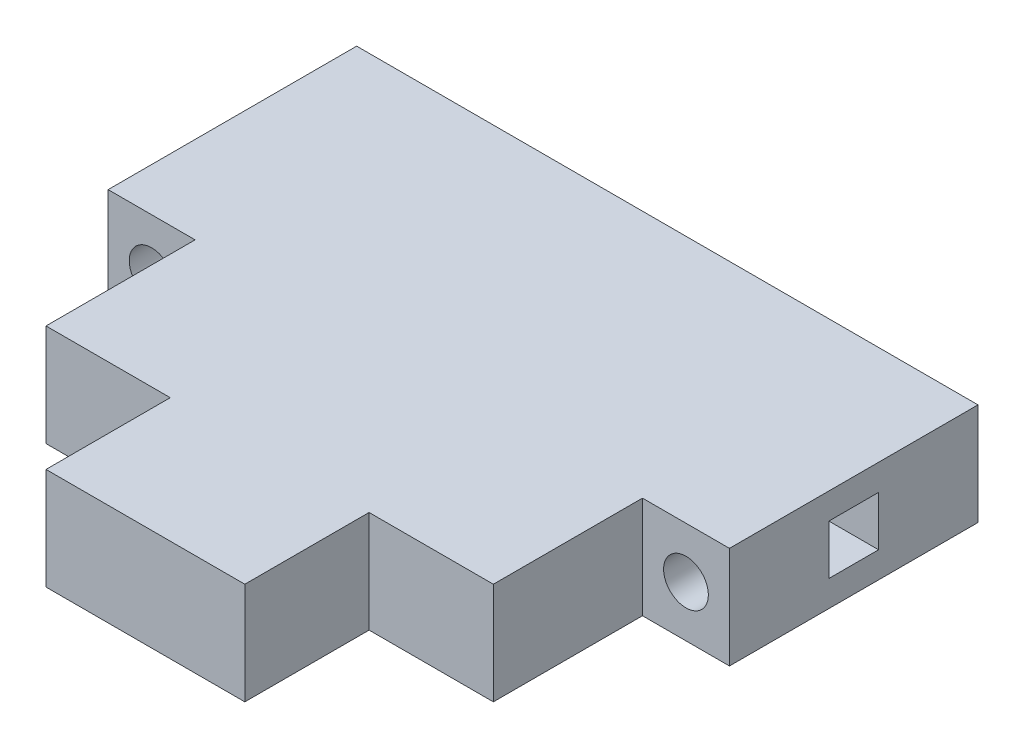
ISO-10303-21;
HEADER;
FILE_DESCRIPTION(('STEP AP214'),'2;1');
FILE_NAME('part.step','',(''),(''),'','','');
FILE_SCHEMA(('AUTOMOTIVE_DESIGN { 1 0 10303 214 1 1 1 1 }'));
ENDSEC;
DATA;
#1=APPLICATION_CONTEXT('core data for automotive mechanical design processes');
#2=APPLICATION_PROTOCOL_DEFINITION('international standard','automotive_design',2000,#1);
#3=PRODUCT_CONTEXT('',#1,'mechanical');
#4=PRODUCT('Part','Part','',(#3));
#5=PRODUCT_RELATED_PRODUCT_CATEGORY('part','',(#4));
#6=PRODUCT_DEFINITION_FORMATION('','',#4);
#7=PRODUCT_DEFINITION_CONTEXT('part definition',#1,'design');
#8=PRODUCT_DEFINITION('design','',#6,#7);
#9=PRODUCT_DEFINITION_SHAPE('','',#8);
#10=(LENGTH_UNIT() NAMED_UNIT(*) SI_UNIT(.MILLI.,.METRE.));
#11=(NAMED_UNIT(*) PLANE_ANGLE_UNIT() SI_UNIT($,.RADIAN.));
#12=(NAMED_UNIT(*) SI_UNIT($,.STERADIAN.) SOLID_ANGLE_UNIT());
#13=UNCERTAINTY_MEASURE_WITH_UNIT(LENGTH_MEASURE(1.E-05),#10,'distance_accuracy_value','');
#14=(GEOMETRIC_REPRESENTATION_CONTEXT(3) GLOBAL_UNCERTAINTY_ASSIGNED_CONTEXT((#13)) GLOBAL_UNIT_ASSIGNED_CONTEXT((#10,
#11,#12)) REPRESENTATION_CONTEXT('',''));
#15=CARTESIAN_POINT('',(0.,0.,0.));
#16=DIRECTION('',(0.,0.,1.));
#17=DIRECTION('',(1.,0.,0.));
#18=AXIS2_PLACEMENT_3D('',#15,#16,#17);
#19=CARTESIAN_POINT('',(-25.,8.2,20.));
#20=DIRECTION('',(1.,0.,0.));
#21=DIRECTION('',(0.,0.,-1.));
#22=AXIS2_PLACEMENT_3D('',#19,#20,#21);
#23=PLANE('',#22);
#24=DIRECTION('',(0.,0.,1.));
#25=VECTOR('',#24,1.);
#26=CARTESIAN_POINT('',(-25.,0.,20.));
#27=LINE('',#26,#25);
#28=CARTESIAN_POINT('',(-25.,0.,0.));
#29=VERTEX_POINT('',#28);
#30=CARTESIAN_POINT('',(-25.,0.,20.));
#31=VERTEX_POINT('',#30);
#32=EDGE_CURVE('E235',#29,#31,#27,.T.);
#33=ORIENTED_EDGE('',*,*,#32,.T.);
#34=DIRECTION('',(0.,-1.,0.));
#35=VECTOR('',#34,1.);
#36=CARTESIAN_POINT('',(-25.,8.2,20.));
#37=LINE('',#36,#35);
#38=CARTESIAN_POINT('',(-25.,8.2,20.));
#39=VERTEX_POINT('',#38);
#40=EDGE_CURVE('E11',#39,#31,#37,.T.);
#41=ORIENTED_EDGE('',*,*,#40,.F.);
#42=DIRECTION('',(0.,0.,1.));
#43=VECTOR('',#42,1.);
#44=CARTESIAN_POINT('',(-25.,8.2,20.));
#45=LINE('',#44,#43);
#46=CARTESIAN_POINT('',(-25.,8.2,0.));
#47=VERTEX_POINT('',#46);
#48=EDGE_CURVE('E244',#47,#39,#45,.T.);
#49=ORIENTED_EDGE('',*,*,#48,.F.);
#50=DIRECTION('',(0.,-1.,0.));
#51=VECTOR('',#50,1.);
#52=CARTESIAN_POINT('',(-25.,8.2,0.));
#53=LINE('',#52,#51);
#54=EDGE_CURVE('E270',#47,#29,#53,.T.);
#55=ORIENTED_EDGE('',*,*,#54,.T.);
#56=EDGE_LOOP('',(#33,#41,#49,#55));
#57=FACE_BOUND('',#56,.T.);
#58=DIRECTION('',(0.,1.,0.));
#59=VECTOR('',#58,1.);
#60=CARTESIAN_POINT('',(-25.,2.1,8.));
#61=LINE('',#60,#59);
#62=CARTESIAN_POINT('',(-25.,2.1,8.));
#63=VERTEX_POINT('',#62);
#64=CARTESIAN_POINT('',(-25.,6.1,8.));
#65=VERTEX_POINT('',#64);
#66=EDGE_CURVE('E53',#63,#65,#61,.T.);
#67=ORIENTED_EDGE('',*,*,#66,.T.);
#68=DIRECTION('',(0.,0.,1.));
#69=VECTOR('',#68,1.);
#70=CARTESIAN_POINT('',(-25.,6.1,8.));
#71=LINE('',#70,#69);
#72=CARTESIAN_POINT('',(-25.,6.1,12.));
#73=VERTEX_POINT('',#72);
#74=EDGE_CURVE('E194',#65,#73,#71,.T.);
#75=ORIENTED_EDGE('',*,*,#74,.T.);
#76=DIRECTION('',(0.,-1.,0.));
#77=VECTOR('',#76,1.);
#78=CARTESIAN_POINT('',(-25.,2.1,12.));
#79=LINE('',#78,#77);
#80=CARTESIAN_POINT('',(-25.,2.1,12.));
#81=VERTEX_POINT('',#80);
#82=EDGE_CURVE('E627',#73,#81,#79,.T.);
#83=ORIENTED_EDGE('',*,*,#82,.T.);
#84=DIRECTION('',(0.,0.,-1.));
#85=VECTOR('',#84,1.);
#86=CARTESIAN_POINT('',(-25.,2.1,8.));
#87=LINE('',#86,#85);
#88=EDGE_CURVE('E190',#81,#63,#87,.T.);
#89=ORIENTED_EDGE('',*,*,#88,.T.);
#90=EDGE_LOOP('',(#67,#75,#83,#89));
#91=FACE_BOUND('',#90,.T.);
#92=ADVANCED_FACE('F39',(#57,#91),#23,.F.);
#93=CARTESIAN_POINT('',(-18.,8.2,20.));
#94=DIRECTION('',(0.,0.,-1.));
#95=DIRECTION('',(-1.,0.,0.));
#96=AXIS2_PLACEMENT_3D('',#93,#94,#95);
#97=PLANE('',#96);
#98=CARTESIAN_POINT('',(-21.5,4.1,20.));
#99=DIRECTION('',(0.,0.,1.));
#100=DIRECTION('',(1.,0.,0.));
#101=AXIS2_PLACEMENT_3D('',#98,#99,#100);
#102=CIRCLE('',#101,1.8);
#103=CARTESIAN_POINT('',(-19.7,4.1,20.));
#104=VERTEX_POINT('',#103);
#105=EDGE_CURVE('E236',#104,#104,#102,.T.);
#106=ORIENTED_EDGE('',*,*,#105,.F.);
#107=EDGE_LOOP('',(#106));
#108=FACE_BOUND('',#107,.T.);
#109=DIRECTION('',(1.,0.,0.));
#110=VECTOR('',#109,1.);
#111=CARTESIAN_POINT('',(-18.,0.,20.));
#112=LINE('',#111,#110);
#113=CARTESIAN_POINT('',(-18.,0.,20.));
#114=VERTEX_POINT('',#113);
#115=EDGE_CURVE('E273',#31,#114,#112,.T.);
#116=ORIENTED_EDGE('',*,*,#115,.T.);
#117=DIRECTION('',(0.,-1.,0.));
#118=VECTOR('',#117,1.);
#119=CARTESIAN_POINT('',(-18.,8.2,20.));
#120=LINE('',#119,#118);
#121=CARTESIAN_POINT('',(-18.,8.2,20.));
#122=VERTEX_POINT('',#121);
#123=EDGE_CURVE('E46',#122,#114,#120,.T.);
#124=ORIENTED_EDGE('',*,*,#123,.F.);
#125=DIRECTION('',(1.,0.,0.));
#126=VECTOR('',#125,1.);
#127=CARTESIAN_POINT('',(-18.,8.2,20.));
#128=LINE('',#127,#126);
#129=EDGE_CURVE('E247',#39,#122,#128,.T.);
#130=ORIENTED_EDGE('',*,*,#129,.F.);
#131=ORIENTED_EDGE('',*,*,#40,.T.);
#132=EDGE_LOOP('',(#116,#124,#130,#131));
#133=FACE_BOUND('',#132,.T.);
#134=ADVANCED_FACE('F350',(#108,#133),#97,.F.);
#135=CARTESIAN_POINT('',(-18.,8.2,32.));
#136=DIRECTION('',(1.,0.,0.));
#137=DIRECTION('',(0.,0.,-1.));
#138=AXIS2_PLACEMENT_3D('',#135,#136,#137);
#139=PLANE('',#138);
#140=DIRECTION('',(0.,0.,1.));
#141=VECTOR('',#140,1.);
#142=CARTESIAN_POINT('',(-18.,0.,32.));
#143=LINE('',#142,#141);
#144=CARTESIAN_POINT('',(-18.,0.,32.));
#145=VERTEX_POINT('',#144);
#146=EDGE_CURVE('E275',#114,#145,#143,.T.);
#147=ORIENTED_EDGE('',*,*,#146,.T.);
#148=DIRECTION('',(0.,-1.,0.));
#149=VECTOR('',#148,1.);
#150=CARTESIAN_POINT('',(-18.,8.2,32.));
#151=LINE('',#150,#149);
#152=CARTESIAN_POINT('',(-18.,8.2,32.));
#153=VERTEX_POINT('',#152);
#154=EDGE_CURVE('E320',#153,#145,#151,.T.);
#155=ORIENTED_EDGE('',*,*,#154,.F.);
#156=DIRECTION('',(0.,0.,1.));
#157=VECTOR('',#156,1.);
#158=CARTESIAN_POINT('',(-18.,8.2,32.));
#159=LINE('',#158,#157);
#160=EDGE_CURVE('E250',#122,#153,#159,.T.);
#161=ORIENTED_EDGE('',*,*,#160,.F.);
#162=ORIENTED_EDGE('',*,*,#123,.T.);
#163=EDGE_LOOP('',(#147,#155,#161,#162));
#164=FACE_BOUND('',#163,.T.);
#165=ADVANCED_FACE('F327',(#164),#139,.F.);
#166=CARTESIAN_POINT('',(-8.,8.2,32.));
#167=DIRECTION('',(0.,0.,-1.));
#168=DIRECTION('',(-1.,0.,0.));
#169=AXIS2_PLACEMENT_3D('',#166,#167,#168);
#170=PLANE('',#169);
#171=DIRECTION('',(1.,0.,0.));
#172=VECTOR('',#171,1.);
#173=CARTESIAN_POINT('',(-8.,0.,32.));
#174=LINE('',#173,#172);
#175=CARTESIAN_POINT('',(-8.,0.,32.));
#176=VERTEX_POINT('',#175);
#177=EDGE_CURVE('E277',#145,#176,#174,.T.);
#178=ORIENTED_EDGE('',*,*,#177,.T.);
#179=DIRECTION('',(0.,-1.,0.));
#180=VECTOR('',#179,1.);
#181=CARTESIAN_POINT('',(-8.,8.2,32.));
#182=LINE('',#181,#180);
#183=CARTESIAN_POINT('',(-8.,8.2,32.));
#184=VERTEX_POINT('',#183);
#185=EDGE_CURVE('E317',#184,#176,#182,.T.);
#186=ORIENTED_EDGE('',*,*,#185,.F.);
#187=DIRECTION('',(1.,0.,0.));
#188=VECTOR('',#187,1.);
#189=CARTESIAN_POINT('',(-8.,8.2,32.));
#190=LINE('',#189,#188);
#191=EDGE_CURVE('E252',#153,#184,#190,.T.);
#192=ORIENTED_EDGE('',*,*,#191,.F.);
#193=ORIENTED_EDGE('',*,*,#154,.T.);
#194=EDGE_LOOP('',(#178,#186,#192,#193));
#195=FACE_BOUND('',#194,.T.);
#196=ADVANCED_FACE('F338',(#195),#170,.F.);
#197=CARTESIAN_POINT('',(-8.,8.2,42.));
#198=DIRECTION('',(1.,0.,0.));
#199=DIRECTION('',(0.,0.,-1.));
#200=AXIS2_PLACEMENT_3D('',#197,#198,#199);
#201=PLANE('',#200);
#202=DIRECTION('',(0.,0.,1.));
#203=VECTOR('',#202,1.);
#204=CARTESIAN_POINT('',(-8.,0.,42.));
#205=LINE('',#204,#203);
#206=CARTESIAN_POINT('',(-8.,0.,42.));
#207=VERTEX_POINT('',#206);
#208=EDGE_CURVE('E279',#176,#207,#205,.T.);
#209=ORIENTED_EDGE('',*,*,#208,.T.);
#210=DIRECTION('',(0.,-1.,0.));
#211=VECTOR('',#210,1.);
#212=CARTESIAN_POINT('',(-8.,8.2,42.));
#213=LINE('',#212,#211);
#214=CARTESIAN_POINT('',(-8.,8.2,42.));
#215=VERTEX_POINT('',#214);
#216=EDGE_CURVE('E314',#215,#207,#213,.T.);
#217=ORIENTED_EDGE('',*,*,#216,.F.);
#218=DIRECTION('',(0.,0.,1.));
#219=VECTOR('',#218,1.);
#220=CARTESIAN_POINT('',(-8.,8.2,42.));
#221=LINE('',#220,#219);
#222=EDGE_CURVE('E254',#184,#215,#221,.T.);
#223=ORIENTED_EDGE('',*,*,#222,.F.);
#224=ORIENTED_EDGE('',*,*,#185,.T.);
#225=EDGE_LOOP('',(#209,#217,#223,#224));
#226=FACE_BOUND('',#225,.T.);
#227=ADVANCED_FACE('F342',(#226),#201,.F.);
#228=CARTESIAN_POINT('',(8.,8.2,42.));
#229=DIRECTION('',(0.,0.,-1.));
#230=DIRECTION('',(-1.,0.,0.));
#231=AXIS2_PLACEMENT_3D('',#228,#229,#230);
#232=PLANE('',#231);
#233=DIRECTION('',(1.,0.,0.));
#234=VECTOR('',#233,1.);
#235=CARTESIAN_POINT('',(8.,0.,42.));
#236=LINE('',#235,#234);
#237=CARTESIAN_POINT('',(8.,0.,42.));
#238=VERTEX_POINT('',#237);
#239=EDGE_CURVE('E281',#207,#238,#236,.T.);
#240=ORIENTED_EDGE('',*,*,#239,.T.);
#241=DIRECTION('',(0.,-1.,0.));
#242=VECTOR('',#241,1.);
#243=CARTESIAN_POINT('',(8.,8.2,42.));
#244=LINE('',#243,#242);
#245=CARTESIAN_POINT('',(8.,8.2,42.));
#246=VERTEX_POINT('',#245);
#247=EDGE_CURVE('E311',#246,#238,#244,.T.);
#248=ORIENTED_EDGE('',*,*,#247,.F.);
#249=DIRECTION('',(1.,0.,0.));
#250=VECTOR('',#249,1.);
#251=CARTESIAN_POINT('',(8.,8.2,42.));
#252=LINE('',#251,#250);
#253=EDGE_CURVE('E256',#215,#246,#252,.T.);
#254=ORIENTED_EDGE('',*,*,#253,.F.);
#255=ORIENTED_EDGE('',*,*,#216,.T.);
#256=EDGE_LOOP('',(#240,#248,#254,#255));
#257=FACE_BOUND('',#256,.T.);
#258=ADVANCED_FACE('F384',(#257),#232,.F.);
#259=CARTESIAN_POINT('',(8.,8.2,32.));
#260=DIRECTION('',(-1.,0.,0.));
#261=DIRECTION('',(0.,0.,1.));
#262=AXIS2_PLACEMENT_3D('',#259,#260,#261);
#263=PLANE('',#262);
#264=DIRECTION('',(0.,0.,-1.));
#265=VECTOR('',#264,1.);
#266=CARTESIAN_POINT('',(8.,0.,32.));
#267=LINE('',#266,#265);
#268=CARTESIAN_POINT('',(8.,0.,32.));
#269=VERTEX_POINT('',#268);
#270=EDGE_CURVE('E283',#238,#269,#267,.T.);
#271=ORIENTED_EDGE('',*,*,#270,.T.);
#272=DIRECTION('',(0.,-1.,0.));
#273=VECTOR('',#272,1.);
#274=CARTESIAN_POINT('',(8.,8.2,32.));
#275=LINE('',#274,#273);
#276=CARTESIAN_POINT('',(8.,8.2,32.));
#277=VERTEX_POINT('',#276);
#278=EDGE_CURVE('E308',#277,#269,#275,.T.);
#279=ORIENTED_EDGE('',*,*,#278,.F.);
#280=DIRECTION('',(0.,0.,-1.));
#281=VECTOR('',#280,1.);
#282=CARTESIAN_POINT('',(8.,8.2,32.));
#283=LINE('',#282,#281);
#284=EDGE_CURVE('E258',#246,#277,#283,.T.);
#285=ORIENTED_EDGE('',*,*,#284,.F.);
#286=ORIENTED_EDGE('',*,*,#247,.T.);
#287=EDGE_LOOP('',(#271,#279,#285,#286));
#288=FACE_BOUND('',#287,.T.);
#289=ADVANCED_FACE('F382',(#288),#263,.F.);
#290=CARTESIAN_POINT('',(18.,8.2,32.));
#291=DIRECTION('',(0.,0.,-1.));
#292=DIRECTION('',(-1.,0.,0.));
#293=AXIS2_PLACEMENT_3D('',#290,#291,#292);
#294=PLANE('',#293);
#295=DIRECTION('',(1.,0.,0.));
#296=VECTOR('',#295,1.);
#297=CARTESIAN_POINT('',(18.,0.,32.));
#298=LINE('',#297,#296);
#299=CARTESIAN_POINT('',(18.,0.,32.));
#300=VERTEX_POINT('',#299);
#301=EDGE_CURVE('E285',#269,#300,#298,.T.);
#302=ORIENTED_EDGE('',*,*,#301,.T.);
#303=DIRECTION('',(0.,-1.,0.));
#304=VECTOR('',#303,1.);
#305=CARTESIAN_POINT('',(18.,8.2,32.));
#306=LINE('',#305,#304);
#307=CARTESIAN_POINT('',(18.,8.2,32.));
#308=VERTEX_POINT('',#307);
#309=EDGE_CURVE('E305',#308,#300,#306,.T.);
#310=ORIENTED_EDGE('',*,*,#309,.F.);
#311=DIRECTION('',(1.,0.,0.));
#312=VECTOR('',#311,1.);
#313=CARTESIAN_POINT('',(18.,8.2,32.));
#314=LINE('',#313,#312);
#315=EDGE_CURVE('E260',#277,#308,#314,.T.);
#316=ORIENTED_EDGE('',*,*,#315,.F.);
#317=ORIENTED_EDGE('',*,*,#278,.T.);
#318=EDGE_LOOP('',(#302,#310,#316,#317));
#319=FACE_BOUND('',#318,.T.);
#320=ADVANCED_FACE('F378',(#319),#294,.F.);
#321=CARTESIAN_POINT('',(18.,8.2,20.));
#322=DIRECTION('',(-1.,0.,0.));
#323=DIRECTION('',(0.,0.,1.));
#324=AXIS2_PLACEMENT_3D('',#321,#322,#323);
#325=PLANE('',#324);
#326=DIRECTION('',(0.,0.,-1.));
#327=VECTOR('',#326,1.);
#328=CARTESIAN_POINT('',(18.,0.,20.));
#329=LINE('',#328,#327);
#330=CARTESIAN_POINT('',(18.,0.,20.));
#331=VERTEX_POINT('',#330);
#332=EDGE_CURVE('E287',#300,#331,#329,.T.);
#333=ORIENTED_EDGE('',*,*,#332,.T.);
#334=DIRECTION('',(0.,-1.,0.));
#335=VECTOR('',#334,1.);
#336=CARTESIAN_POINT('',(18.,8.2,20.));
#337=LINE('',#336,#335);
#338=CARTESIAN_POINT('',(18.,8.2,20.));
#339=VERTEX_POINT('',#338);
#340=EDGE_CURVE('E302',#339,#331,#337,.T.);
#341=ORIENTED_EDGE('',*,*,#340,.F.);
#342=DIRECTION('',(0.,0.,-1.));
#343=VECTOR('',#342,1.);
#344=CARTESIAN_POINT('',(18.,8.2,20.));
#345=LINE('',#344,#343);
#346=EDGE_CURVE('E262',#308,#339,#345,.T.);
#347=ORIENTED_EDGE('',*,*,#346,.F.);
#348=ORIENTED_EDGE('',*,*,#309,.T.);
#349=EDGE_LOOP('',(#333,#341,#347,#348));
#350=FACE_BOUND('',#349,.T.);
#351=ADVANCED_FACE('F373',(#350),#325,.F.);
#352=CARTESIAN_POINT('',(25.,8.2,20.));
#353=DIRECTION('',(0.,0.,-1.));
#354=DIRECTION('',(-1.,0.,0.));
#355=AXIS2_PLACEMENT_3D('',#352,#353,#354);
#356=PLANE('',#355);
#357=CARTESIAN_POINT('',(21.5,4.1,20.));
#358=DIRECTION('',(0.,0.,1.));
#359=DIRECTION('',(1.,0.,0.));
#360=AXIS2_PLACEMENT_3D('',#357,#358,#359);
#361=CIRCLE('',#360,1.8);
#362=CARTESIAN_POINT('',(23.3,4.1,20.));
#363=VERTEX_POINT('',#362);
#364=EDGE_CURVE('E239',#363,#363,#361,.T.);
#365=ORIENTED_EDGE('',*,*,#364,.F.);
#366=EDGE_LOOP('',(#365));
#367=FACE_BOUND('',#366,.T.);
#368=DIRECTION('',(1.,0.,0.));
#369=VECTOR('',#368,1.);
#370=CARTESIAN_POINT('',(25.,0.,20.));
#371=LINE('',#370,#369);
#372=CARTESIAN_POINT('',(25.,0.,20.));
#373=VERTEX_POINT('',#372);
#374=EDGE_CURVE('E289',#331,#373,#371,.T.);
#375=ORIENTED_EDGE('',*,*,#374,.T.);
#376=DIRECTION('',(0.,-1.,0.));
#377=VECTOR('',#376,1.);
#378=CARTESIAN_POINT('',(25.,8.2,20.));
#379=LINE('',#378,#377);
#380=CARTESIAN_POINT('',(25.,8.2,20.));
#381=VERTEX_POINT('',#380);
#382=EDGE_CURVE('E299',#381,#373,#379,.T.);
#383=ORIENTED_EDGE('',*,*,#382,.F.);
#384=DIRECTION('',(1.,0.,0.));
#385=VECTOR('',#384,1.);
#386=CARTESIAN_POINT('',(25.,8.2,20.));
#387=LINE('',#386,#385);
#388=EDGE_CURVE('E264',#339,#381,#387,.T.);
#389=ORIENTED_EDGE('',*,*,#388,.F.);
#390=ORIENTED_EDGE('',*,*,#340,.T.);
#391=EDGE_LOOP('',(#375,#383,#389,#390));
#392=FACE_BOUND('',#391,.T.);
#393=ADVANCED_FACE('F367',(#367,#392),#356,.F.);
#394=CARTESIAN_POINT('',(25.,8.2,0.));
#395=DIRECTION('',(-1.,0.,0.));
#396=DIRECTION('',(0.,0.,1.));
#397=AXIS2_PLACEMENT_3D('',#394,#395,#396);
#398=PLANE('',#397);
#399=DIRECTION('',(0.,0.,1.));
#400=VECTOR('',#399,1.);
#401=CARTESIAN_POINT('',(25.,6.1,8.));
#402=LINE('',#401,#400);
#403=CARTESIAN_POINT('',(25.,6.1,8.));
#404=VERTEX_POINT('',#403);
#405=CARTESIAN_POINT('',(25.,6.1,12.));
#406=VERTEX_POINT('',#405);
#407=EDGE_CURVE('E197',#404,#406,#402,.T.);
#408=ORIENTED_EDGE('',*,*,#407,.F.);
#409=DIRECTION('',(0.,1.,0.));
#410=VECTOR('',#409,1.);
#411=CARTESIAN_POINT('',(25.,2.1,8.));
#412=LINE('',#411,#410);
#413=CARTESIAN_POINT('',(25.,2.1,8.));
#414=VERTEX_POINT('',#413);
#415=EDGE_CURVE('E61',#414,#404,#412,.T.);
#416=ORIENTED_EDGE('',*,*,#415,.F.);
#417=DIRECTION('',(0.,0.,-1.));
#418=VECTOR('',#417,1.);
#419=CARTESIAN_POINT('',(25.,2.1,8.));
#420=LINE('',#419,#418);
#421=CARTESIAN_POINT('',(25.,2.1,12.));
#422=VERTEX_POINT('',#421);
#423=EDGE_CURVE('E207',#422,#414,#420,.T.);
#424=ORIENTED_EDGE('',*,*,#423,.F.);
#425=DIRECTION('',(0.,-1.,0.));
#426=VECTOR('',#425,1.);
#427=CARTESIAN_POINT('',(25.,2.1,12.));
#428=LINE('',#427,#426);
#429=EDGE_CURVE('E219',#406,#422,#428,.T.);
#430=ORIENTED_EDGE('',*,*,#429,.F.);
#431=EDGE_LOOP('',(#408,#416,#424,#430));
#432=FACE_BOUND('',#431,.T.);
#433=DIRECTION('',(0.,0.,-1.));
#434=VECTOR('',#433,1.);
#435=CARTESIAN_POINT('',(25.,0.,0.));
#436=LINE('',#435,#434);
#437=CARTESIAN_POINT('',(25.,0.,0.));
#438=VERTEX_POINT('',#437);
#439=EDGE_CURVE('E291',#373,#438,#436,.T.);
#440=ORIENTED_EDGE('',*,*,#439,.T.);
#441=DIRECTION('',(0.,-1.,0.));
#442=VECTOR('',#441,1.);
#443=CARTESIAN_POINT('',(25.,8.2,0.));
#444=LINE('',#443,#442);
#445=CARTESIAN_POINT('',(25.,8.2,0.));
#446=VERTEX_POINT('',#445);
#447=EDGE_CURVE('E296',#446,#438,#444,.T.);
#448=ORIENTED_EDGE('',*,*,#447,.F.);
#449=DIRECTION('',(0.,0.,-1.));
#450=VECTOR('',#449,1.);
#451=CARTESIAN_POINT('',(25.,8.2,0.));
#452=LINE('',#451,#450);
#453=EDGE_CURVE('E266',#381,#446,#452,.T.);
#454=ORIENTED_EDGE('',*,*,#453,.F.);
#455=ORIENTED_EDGE('',*,*,#382,.T.);
#456=EDGE_LOOP('',(#440,#448,#454,#455));
#457=FACE_BOUND('',#456,.T.);
#458=ADVANCED_FACE('F363',(#432,#457),#398,.F.);
#459=CARTESIAN_POINT('',(-25.,8.2,0.));
#460=DIRECTION('',(0.,0.,1.));
#461=DIRECTION('',(1.,0.,0.));
#462=AXIS2_PLACEMENT_3D('',#459,#460,#461);
#463=PLANE('',#462);
#464=DIRECTION('',(-1.,0.,0.));
#465=VECTOR('',#464,1.);
#466=CARTESIAN_POINT('',(-25.,0.,0.));
#467=LINE('',#466,#465);
#468=EDGE_CURVE('E248',#438,#29,#467,.T.);
#469=ORIENTED_EDGE('',*,*,#468,.T.);
#470=ORIENTED_EDGE('',*,*,#54,.F.);
#471=DIRECTION('',(-1.,0.,0.));
#472=VECTOR('',#471,1.);
#473=CARTESIAN_POINT('',(-25.,8.2,0.));
#474=LINE('',#473,#472);
#475=EDGE_CURVE('E268',#446,#47,#474,.T.);
#476=ORIENTED_EDGE('',*,*,#475,.F.);
#477=ORIENTED_EDGE('',*,*,#447,.T.);
#478=EDGE_LOOP('',(#469,#470,#476,#477));
#479=FACE_BOUND('',#478,.T.);
#480=ADVANCED_FACE('F358',(#479),#463,.F.);
#481=CARTESIAN_POINT('',(0.,8.2,0.));
#482=DIRECTION('',(0.,-1.,0.));
#483=DIRECTION('',(0.,0.,-1.));
#484=AXIS2_PLACEMENT_3D('',#481,#482,#483);
#485=PLANE('',#484);
#486=ORIENTED_EDGE('',*,*,#48,.T.);
#487=ORIENTED_EDGE('',*,*,#129,.T.);
#488=ORIENTED_EDGE('',*,*,#160,.T.);
#489=ORIENTED_EDGE('',*,*,#191,.T.);
#490=ORIENTED_EDGE('',*,*,#222,.T.);
#491=ORIENTED_EDGE('',*,*,#253,.T.);
#492=ORIENTED_EDGE('',*,*,#284,.T.);
#493=ORIENTED_EDGE('',*,*,#315,.T.);
#494=ORIENTED_EDGE('',*,*,#346,.T.);
#495=ORIENTED_EDGE('',*,*,#388,.T.);
#496=ORIENTED_EDGE('',*,*,#453,.T.);
#497=ORIENTED_EDGE('',*,*,#475,.T.);
#498=EDGE_LOOP('',(#486,#487,#488,#489,#490,#491,#492,#493,#494,#495,#496,#497));
#499=FACE_BOUND('',#498,.T.);
#500=ADVANCED_FACE('F346',(#499),#485,.F.);
#501=CARTESIAN_POINT('',(0.,0.,0.));
#502=DIRECTION('',(0.,-1.,0.));
#503=DIRECTION('',(0.,0.,-1.));
#504=AXIS2_PLACEMENT_3D('',#501,#502,#503);
#505=PLANE('',#504);
#506=ORIENTED_EDGE('',*,*,#32,.F.);
#507=ORIENTED_EDGE('',*,*,#468,.F.);
#508=ORIENTED_EDGE('',*,*,#439,.F.);
#509=ORIENTED_EDGE('',*,*,#374,.F.);
#510=ORIENTED_EDGE('',*,*,#332,.F.);
#511=ORIENTED_EDGE('',*,*,#301,.F.);
#512=ORIENTED_EDGE('',*,*,#270,.F.);
#513=ORIENTED_EDGE('',*,*,#239,.F.);
#514=ORIENTED_EDGE('',*,*,#208,.F.);
#515=ORIENTED_EDGE('',*,*,#177,.F.);
#516=ORIENTED_EDGE('',*,*,#146,.F.);
#517=ORIENTED_EDGE('',*,*,#115,.F.);
#518=EDGE_LOOP('',(#506,#507,#508,#509,#510,#511,#512,#513,#514,#515,#516,#517));
#519=FACE_BOUND('',#518,.T.);
#520=ADVANCED_FACE('F333',(#519),#505,.T.);
#521=CARTESIAN_POINT('',(21.5,4.1,14.));
#522=DIRECTION('',(0.,0.,1.));
#523=DIRECTION('',(1.,0.,0.));
#524=AXIS2_PLACEMENT_3D('',#521,#522,#523);
#525=CYLINDRICAL_SURFACE('',#524,1.8);
#526=CARTESIAN_POINT('',(21.5,4.1,14.));
#527=DIRECTION('',(0.,0.,1.));
#528=DIRECTION('',(1.,0.,0.));
#529=AXIS2_PLACEMENT_3D('',#526,#527,#528);
#530=CIRCLE('',#529,1.8);
#531=CARTESIAN_POINT('',(23.3,4.1,14.));
#532=VERTEX_POINT('',#531);
#533=EDGE_CURVE('E226',#532,#532,#530,.T.);
#534=ORIENTED_EDGE('',*,*,#533,.F.);
#535=EDGE_LOOP('',(#534));
#536=FACE_BOUND('',#535,.T.);
#537=ORIENTED_EDGE('',*,*,#364,.T.);
#538=EDGE_LOOP('',(#537));
#539=FACE_BOUND('',#538,.T.);
#540=ADVANCED_FACE('F489',(#536,#539),#525,.F.);
#541=CARTESIAN_POINT('',(21.5,4.1,14.));
#542=DIRECTION('',(0.,0.,1.));
#543=DIRECTION('',(1.,0.,0.));
#544=AXIS2_PLACEMENT_3D('',#541,#542,#543);
#545=PLANE('',#544);
#546=ORIENTED_EDGE('',*,*,#533,.T.);
#547=EDGE_LOOP('',(#546));
#548=FACE_BOUND('',#547,.T.);
#549=ADVANCED_FACE('F497',(#548),#545,.T.);
#550=CARTESIAN_POINT('',(-21.5,4.1,14.));
#551=DIRECTION('',(0.,0.,1.));
#552=DIRECTION('',(1.,0.,0.));
#553=AXIS2_PLACEMENT_3D('',#550,#551,#552);
#554=CYLINDRICAL_SURFACE('',#553,1.8);
#555=CARTESIAN_POINT('',(-21.5,4.1,14.));
#556=DIRECTION('',(0.,0.,1.));
#557=DIRECTION('',(1.,0.,0.));
#558=AXIS2_PLACEMENT_3D('',#555,#556,#557);
#559=CIRCLE('',#558,1.8);
#560=CARTESIAN_POINT('',(-19.7,4.1,14.));
#561=VERTEX_POINT('',#560);
#562=EDGE_CURVE('E232',#561,#561,#559,.T.);
#563=ORIENTED_EDGE('',*,*,#562,.F.);
#564=EDGE_LOOP('',(#563));
#565=FACE_BOUND('',#564,.T.);
#566=ORIENTED_EDGE('',*,*,#105,.T.);
#567=EDGE_LOOP('',(#566));
#568=FACE_BOUND('',#567,.T.);
#569=ADVANCED_FACE('F507',(#565,#568),#554,.F.);
#570=CARTESIAN_POINT('',(-21.5,4.1,14.));
#571=DIRECTION('',(0.,0.,1.));
#572=DIRECTION('',(1.,0.,0.));
#573=AXIS2_PLACEMENT_3D('',#570,#571,#572);
#574=PLANE('',#573);
#575=ORIENTED_EDGE('',*,*,#562,.T.);
#576=EDGE_LOOP('',(#575));
#577=FACE_BOUND('',#576,.T.);
#578=ADVANCED_FACE('F517',(#577),#574,.T.);
#579=CARTESIAN_POINT('',(17.,2.1,8.));
#580=DIRECTION('',(0.,0.,-1.));
#581=DIRECTION('',(-1.,0.,0.));
#582=AXIS2_PLACEMENT_3D('',#579,#580,#581);
#583=PLANE('',#582);
#584=ORIENTED_EDGE('',*,*,#415,.T.);
#585=DIRECTION('',(1.,0.,0.));
#586=VECTOR('',#585,1.);
#587=CARTESIAN_POINT('',(17.,6.1,8.));
#588=LINE('',#587,#586);
#589=CARTESIAN_POINT('',(17.,6.1,8.));
#590=VERTEX_POINT('',#589);
#591=EDGE_CURVE('E215',#590,#404,#588,.T.);
#592=ORIENTED_EDGE('',*,*,#591,.F.);
#593=DIRECTION('',(0.,1.,0.));
#594=VECTOR('',#593,1.);
#595=CARTESIAN_POINT('',(17.,2.1,8.));
#596=LINE('',#595,#594);
#597=CARTESIAN_POINT('',(17.,2.1,8.));
#598=VERTEX_POINT('',#597);
#599=EDGE_CURVE('E203',#598,#590,#596,.T.);
#600=ORIENTED_EDGE('',*,*,#599,.F.);
#601=DIRECTION('',(1.,0.,0.));
#602=VECTOR('',#601,1.);
#603=CARTESIAN_POINT('',(17.,2.1,8.));
#604=LINE('',#603,#602);
#605=EDGE_CURVE('E224',#598,#414,#604,.T.);
#606=ORIENTED_EDGE('',*,*,#605,.T.);
#607=EDGE_LOOP('',(#584,#592,#600,#606));
#608=FACE_BOUND('',#607,.T.);
#609=ADVANCED_FACE('F526',(#608),#583,.F.);
#610=CARTESIAN_POINT('',(17.,2.1,8.));
#611=DIRECTION('',(0.,-1.,0.));
#612=DIRECTION('',(0.,0.,-1.));
#613=AXIS2_PLACEMENT_3D('',#610,#611,#612);
#614=PLANE('',#613);
#615=ORIENTED_EDGE('',*,*,#423,.T.);
#616=ORIENTED_EDGE('',*,*,#605,.F.);
#617=DIRECTION('',(0.,0.,-1.));
#618=VECTOR('',#617,1.);
#619=CARTESIAN_POINT('',(17.,2.1,8.));
#620=LINE('',#619,#618);
#621=CARTESIAN_POINT('',(17.,2.1,12.));
#622=VERTEX_POINT('',#621);
#623=EDGE_CURVE('E213',#622,#598,#620,.T.);
#624=ORIENTED_EDGE('',*,*,#623,.F.);
#625=DIRECTION('',(1.,0.,0.));
#626=VECTOR('',#625,1.);
#627=CARTESIAN_POINT('',(17.,2.1,12.));
#628=LINE('',#627,#626);
#629=EDGE_CURVE('E227',#622,#422,#628,.T.);
#630=ORIENTED_EDGE('',*,*,#629,.T.);
#631=EDGE_LOOP('',(#615,#616,#624,#630));
#632=FACE_BOUND('',#631,.T.);
#633=ADVANCED_FACE('F535',(#632),#614,.F.);
#634=CARTESIAN_POINT('',(17.,2.1,12.));
#635=DIRECTION('',(0.,0.,1.));
#636=DIRECTION('',(1.,0.,0.));
#637=AXIS2_PLACEMENT_3D('',#634,#635,#636);
#638=PLANE('',#637);
#639=ORIENTED_EDGE('',*,*,#429,.T.);
#640=ORIENTED_EDGE('',*,*,#629,.F.);
#641=DIRECTION('',(0.,-1.,0.));
#642=VECTOR('',#641,1.);
#643=CARTESIAN_POINT('',(17.,2.1,12.));
#644=LINE('',#643,#642);
#645=CARTESIAN_POINT('',(17.,6.1,12.));
#646=VERTEX_POINT('',#645);
#647=EDGE_CURVE('E210',#646,#622,#644,.T.);
#648=ORIENTED_EDGE('',*,*,#647,.F.);
#649=DIRECTION('',(1.,0.,0.));
#650=VECTOR('',#649,1.);
#651=CARTESIAN_POINT('',(17.,6.1,12.));
#652=LINE('',#651,#650);
#653=EDGE_CURVE('E229',#646,#406,#652,.T.);
#654=ORIENTED_EDGE('',*,*,#653,.T.);
#655=EDGE_LOOP('',(#639,#640,#648,#654));
#656=FACE_BOUND('',#655,.T.);
#657=ADVANCED_FACE('F544',(#656),#638,.F.);
#658=CARTESIAN_POINT('',(17.,6.1,8.));
#659=DIRECTION('',(0.,1.,0.));
#660=DIRECTION('',(0.,0.,1.));
#661=AXIS2_PLACEMENT_3D('',#658,#659,#660);
#662=PLANE('',#661);
#663=ORIENTED_EDGE('',*,*,#407,.T.);
#664=ORIENTED_EDGE('',*,*,#653,.F.);
#665=DIRECTION('',(0.,0.,1.));
#666=VECTOR('',#665,1.);
#667=CARTESIAN_POINT('',(17.,6.1,8.));
#668=LINE('',#667,#666);
#669=EDGE_CURVE('E206',#590,#646,#668,.T.);
#670=ORIENTED_EDGE('',*,*,#669,.F.);
#671=ORIENTED_EDGE('',*,*,#591,.T.);
#672=EDGE_LOOP('',(#663,#664,#670,#671));
#673=FACE_BOUND('',#672,.T.);
#674=ADVANCED_FACE('F554',(#673),#662,.F.);
#675=CARTESIAN_POINT('',(17.,0.,0.));
#676=DIRECTION('',(1.,0.,0.));
#677=DIRECTION('',(0.,0.,-1.));
#678=AXIS2_PLACEMENT_3D('',#675,#676,#677);
#679=PLANE('',#678);
#680=ORIENTED_EDGE('',*,*,#599,.T.);
#681=ORIENTED_EDGE('',*,*,#669,.T.);
#682=ORIENTED_EDGE('',*,*,#647,.T.);
#683=ORIENTED_EDGE('',*,*,#623,.T.);
#684=EDGE_LOOP('',(#680,#681,#682,#683));
#685=FACE_BOUND('',#684,.T.);
#686=ADVANCED_FACE('F564',(#685),#679,.T.);
#687=CARTESIAN_POINT('',(-17.,2.1,8.));
#688=DIRECTION('',(0.,0.,1.));
#689=DIRECTION('',(1.,0.,0.));
#690=AXIS2_PLACEMENT_3D('',#687,#688,#689);
#691=PLANE('',#690);
#692=ORIENTED_EDGE('',*,*,#66,.F.);
#693=DIRECTION('',(-1.,0.,0.));
#694=VECTOR('',#693,1.);
#695=CARTESIAN_POINT('',(-17.,2.1,8.));
#696=LINE('',#695,#694);
#697=CARTESIAN_POINT('',(-17.,2.1,8.));
#698=VERTEX_POINT('',#697);
#699=EDGE_CURVE('E189',#698,#63,#696,.T.);
#700=ORIENTED_EDGE('',*,*,#699,.F.);
#701=DIRECTION('',(0.,1.,0.));
#702=VECTOR('',#701,1.);
#703=CARTESIAN_POINT('',(-17.,2.1,8.));
#704=LINE('',#703,#702);
#705=CARTESIAN_POINT('',(-17.,6.1,8.));
#706=VERTEX_POINT('',#705);
#707=EDGE_CURVE('E181',#698,#706,#704,.T.);
#708=ORIENTED_EDGE('',*,*,#707,.T.);
#709=DIRECTION('',(-1.,0.,0.));
#710=VECTOR('',#709,1.);
#711=CARTESIAN_POINT('',(-17.,6.1,8.));
#712=LINE('',#711,#710);
#713=EDGE_CURVE('E188',#706,#65,#712,.T.);
#714=ORIENTED_EDGE('',*,*,#713,.T.);
#715=EDGE_LOOP('',(#692,#700,#708,#714));
#716=FACE_BOUND('',#715,.T.);
#717=ADVANCED_FACE('F187',(#716),#691,.T.);
#718=CARTESIAN_POINT('',(-17.,6.1,8.));
#719=DIRECTION('',(0.,-1.,0.));
#720=DIRECTION('',(0.,0.,-1.));
#721=AXIS2_PLACEMENT_3D('',#718,#719,#720);
#722=PLANE('',#721);
#723=ORIENTED_EDGE('',*,*,#74,.F.);
#724=ORIENTED_EDGE('',*,*,#713,.F.);
#725=DIRECTION('',(0.,0.,1.));
#726=VECTOR('',#725,1.);
#727=CARTESIAN_POINT('',(-17.,6.1,8.));
#728=LINE('',#727,#726);
#729=CARTESIAN_POINT('',(-17.,6.1,12.));
#730=VERTEX_POINT('',#729);
#731=EDGE_CURVE('E177',#706,#730,#728,.T.);
#732=ORIENTED_EDGE('',*,*,#731,.T.);
#733=DIRECTION('',(-1.,0.,0.));
#734=VECTOR('',#733,1.);
#735=CARTESIAN_POINT('',(-17.,6.1,12.));
#736=LINE('',#735,#734);
#737=EDGE_CURVE('E195',#730,#73,#736,.T.);
#738=ORIENTED_EDGE('',*,*,#737,.T.);
#739=EDGE_LOOP('',(#723,#724,#732,#738));
#740=FACE_BOUND('',#739,.T.);
#741=ADVANCED_FACE('F192',(#740),#722,.T.);
#742=CARTESIAN_POINT('',(-17.,2.1,12.));
#743=DIRECTION('',(0.,0.,-1.));
#744=DIRECTION('',(-1.,0.,0.));
#745=AXIS2_PLACEMENT_3D('',#742,#743,#744);
#746=PLANE('',#745);
#747=ORIENTED_EDGE('',*,*,#82,.F.);
#748=ORIENTED_EDGE('',*,*,#737,.F.);
#749=DIRECTION('',(0.,-1.,0.));
#750=VECTOR('',#749,1.);
#751=CARTESIAN_POINT('',(-17.,2.1,12.));
#752=LINE('',#751,#750);
#753=CARTESIAN_POINT('',(-17.,2.1,12.));
#754=VERTEX_POINT('',#753);
#755=EDGE_CURVE('E182',#730,#754,#752,.T.);
#756=ORIENTED_EDGE('',*,*,#755,.T.);
#757=DIRECTION('',(-1.,0.,0.));
#758=VECTOR('',#757,1.);
#759=CARTESIAN_POINT('',(-17.,2.1,12.));
#760=LINE('',#759,#758);
#761=EDGE_CURVE('E199',#754,#81,#760,.T.);
#762=ORIENTED_EDGE('',*,*,#761,.T.);
#763=EDGE_LOOP('',(#747,#748,#756,#762));
#764=FACE_BOUND('',#763,.T.);
#765=ADVANCED_FACE('F593',(#764),#746,.T.);
#766=CARTESIAN_POINT('',(-17.,2.1,8.));
#767=DIRECTION('',(0.,1.,0.));
#768=DIRECTION('',(0.,0.,1.));
#769=AXIS2_PLACEMENT_3D('',#766,#767,#768);
#770=PLANE('',#769);
#771=ORIENTED_EDGE('',*,*,#88,.F.);
#772=ORIENTED_EDGE('',*,*,#761,.F.);
#773=DIRECTION('',(0.,0.,-1.));
#774=VECTOR('',#773,1.);
#775=CARTESIAN_POINT('',(-17.,2.1,8.));
#776=LINE('',#775,#774);
#777=EDGE_CURVE('E634',#754,#698,#776,.T.);
#778=ORIENTED_EDGE('',*,*,#777,.T.);
#779=ORIENTED_EDGE('',*,*,#699,.T.);
#780=EDGE_LOOP('',(#771,#772,#778,#779));
#781=FACE_BOUND('',#780,.T.);
#782=ADVANCED_FACE('F602',(#781),#770,.T.);
#783=CARTESIAN_POINT('',(-17.,0.,0.));
#784=DIRECTION('',(1.,0.,0.));
#785=DIRECTION('',(0.,0.,-1.));
#786=AXIS2_PLACEMENT_3D('',#783,#784,#785);
#787=PLANE('',#786);
#788=ORIENTED_EDGE('',*,*,#707,.F.);
#789=ORIENTED_EDGE('',*,*,#777,.F.);
#790=ORIENTED_EDGE('',*,*,#755,.F.);
#791=ORIENTED_EDGE('',*,*,#731,.F.);
#792=EDGE_LOOP('',(#788,#789,#790,#791));
#793=FACE_BOUND('',#792,.T.);
#794=ADVANCED_FACE('F179',(#793),#787,.F.);
#795=CLOSED_SHELL('',(#92,#134,#165,#196,#227,#258,#289,#320,#351,#393,#458,#480,#500,#520,#540,
#549,#569,#578,#609,#633,#657,#674,#686,#717,#741,#765,#782,#794));
#796=MANIFOLD_SOLID_BREP('B2',#795);
#797=ADVANCED_BREP_SHAPE_REPRESENTATION('',(#18,#796),#14);
#798=SHAPE_DEFINITION_REPRESENTATION(#9,#797);
ENDSEC;
END-ISO-10303-21;
